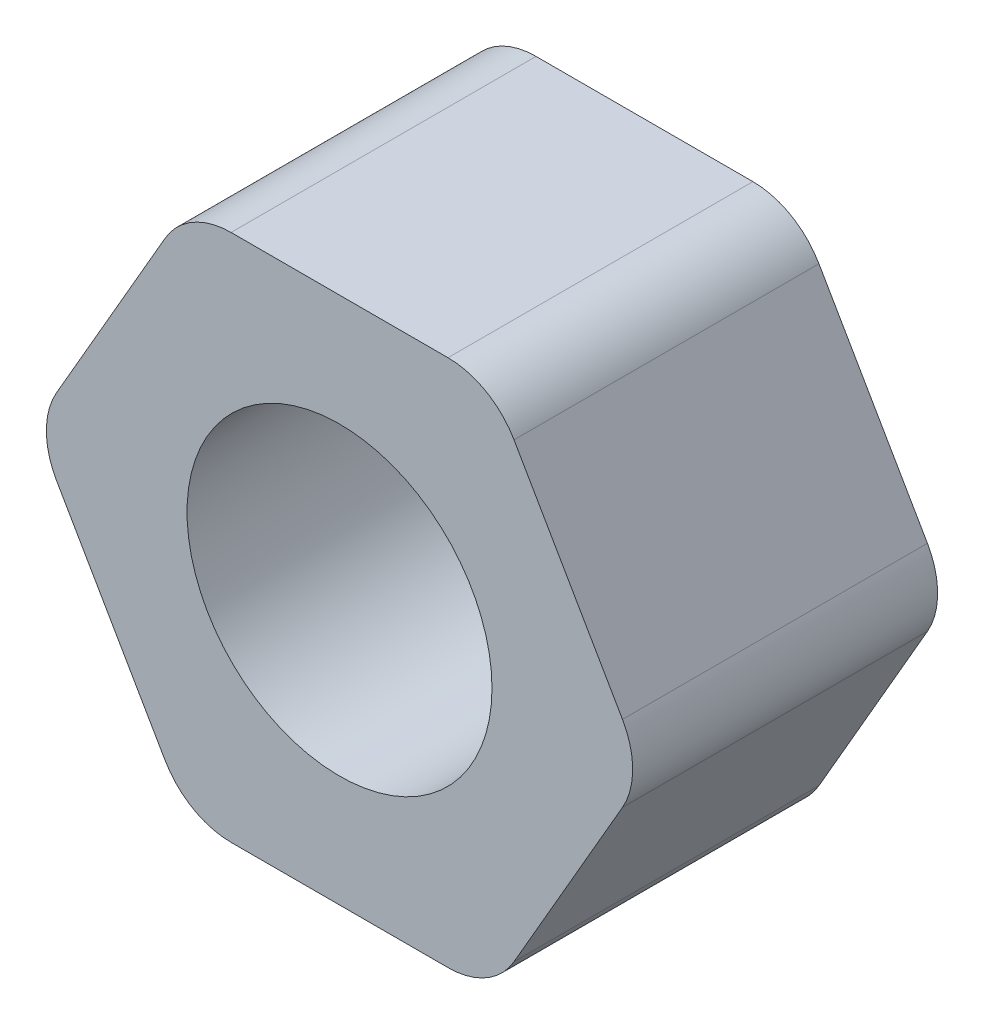
ISO-10303-21;
HEADER;
FILE_DESCRIPTION(('STEP AP214'),'2;1');
FILE_NAME('part.step','',(''),(''),'','','');
FILE_SCHEMA(('AUTOMOTIVE_DESIGN { 1 0 10303 214 1 1 1 1 }'));
ENDSEC;
DATA;
#1=APPLICATION_CONTEXT('core data for automotive mechanical design processes');
#2=APPLICATION_PROTOCOL_DEFINITION('international standard','automotive_design',2000,#1);
#3=PRODUCT_CONTEXT('',#1,'mechanical');
#4=PRODUCT('Part','Part','',(#3));
#5=PRODUCT_RELATED_PRODUCT_CATEGORY('part','',(#4));
#6=PRODUCT_DEFINITION_FORMATION('','',#4);
#7=PRODUCT_DEFINITION_CONTEXT('part definition',#1,'design');
#8=PRODUCT_DEFINITION('design','',#6,#7);
#9=PRODUCT_DEFINITION_SHAPE('','',#8);
#10=(LENGTH_UNIT() NAMED_UNIT(*) SI_UNIT(.MILLI.,.METRE.));
#11=(NAMED_UNIT(*) PLANE_ANGLE_UNIT() SI_UNIT($,.RADIAN.));
#12=(NAMED_UNIT(*) SI_UNIT($,.STERADIAN.) SOLID_ANGLE_UNIT());
#13=UNCERTAINTY_MEASURE_WITH_UNIT(LENGTH_MEASURE(1.E-05),#10,'distance_accuracy_value','');
#14=(GEOMETRIC_REPRESENTATION_CONTEXT(3) GLOBAL_UNCERTAINTY_ASSIGNED_CONTEXT((#13)) GLOBAL_UNIT_ASSIGNED_CONTEXT((#10,
#11,#12)) REPRESENTATION_CONTEXT('',''));
#15=CARTESIAN_POINT('',(0.,0.,0.));
#16=DIRECTION('',(0.,0.,1.));
#17=DIRECTION('',(1.,0.,0.));
#18=AXIS2_PLACEMENT_3D('',#15,#16,#17);
#19=CARTESIAN_POINT('',(-2.84529946162075,0.,4.));
#20=DIRECTION('',(0.,0.,1.));
#21=DIRECTION('',(1.,0.,0.));
#22=AXIS2_PLACEMENT_3D('',#19,#20,#21);
#23=PLANE('',#22);
#24=CARTESIAN_POINT('',(-2.84529946162075,0.,4.));
#25=DIRECTION('',(0.,0.,1.));
#26=DIRECTION('',(1.,0.,0.));
#27=AXIS2_PLACEMENT_3D('',#24,#25,#26);
#28=CIRCLE('',#27,0.999999999999999);
#29=CARTESIAN_POINT('',(-3.71132486540519,0.499999999999999,4.));
#30=VERTEX_POINT('',#29);
#31=CARTESIAN_POINT('',(-3.71132486540519,-0.5,4.));
#32=VERTEX_POINT('',#31);
#33=EDGE_CURVE('E177',#30,#32,#28,.T.);
#34=ORIENTED_EDGE('',*,*,#33,.T.);
#35=DIRECTION('',(0.5,-0.866025403784439,0.));
#36=VECTOR('',#35,1.);
#37=CARTESIAN_POINT('',(-3.71132486540519,-0.5,4.));
#38=LINE('',#37,#36);
#39=CARTESIAN_POINT('',(-2.28867513459481,-2.96410161513776,4.));
#40=VERTEX_POINT('',#39);
#41=EDGE_CURVE('E105',#32,#40,#38,.T.);
#42=ORIENTED_EDGE('',*,*,#41,.T.);
#43=CARTESIAN_POINT('',(-1.42264973081037,-2.46410161513776,4.));
#44=DIRECTION('',(0.,0.,1.));
#45=DIRECTION('',(1.,0.,0.));
#46=AXIS2_PLACEMENT_3D('',#43,#44,#45);
#47=CIRCLE('',#46,1.);
#48=CARTESIAN_POINT('',(-1.42264973081037,-3.46410161513776,4.));
#49=VERTEX_POINT('',#48);
#50=EDGE_CURVE('E204',#40,#49,#47,.T.);
#51=ORIENTED_EDGE('',*,*,#50,.T.);
#52=DIRECTION('',(1.,0.,0.));
#53=VECTOR('',#52,1.);
#54=CARTESIAN_POINT('',(-1.42264973081037,-3.46410161513776,4.));
#55=LINE('',#54,#53);
#56=CARTESIAN_POINT('',(1.42264973081038,-3.46410161513776,4.));
#57=VERTEX_POINT('',#56);
#58=EDGE_CURVE('E223',#49,#57,#55,.T.);
#59=ORIENTED_EDGE('',*,*,#58,.T.);
#60=CARTESIAN_POINT('',(1.42264973081038,-2.46410161513776,4.));
#61=DIRECTION('',(0.,0.,1.));
#62=DIRECTION('',(1.,0.,0.));
#63=AXIS2_PLACEMENT_3D('',#60,#61,#62);
#64=CIRCLE('',#63,1.);
#65=CARTESIAN_POINT('',(2.28867513459481,-2.96410161513776,4.));
#66=VERTEX_POINT('',#65);
#67=EDGE_CURVE('E220',#57,#66,#64,.T.);
#68=ORIENTED_EDGE('',*,*,#67,.T.);
#69=DIRECTION('',(0.5,0.866025403784439,0.));
#70=VECTOR('',#69,1.);
#71=CARTESIAN_POINT('',(2.28867513459481,-2.96410161513776,4.));
#72=LINE('',#71,#70);
#73=CARTESIAN_POINT('',(3.71132486540519,-0.5,4.));
#74=VERTEX_POINT('',#73);
#75=EDGE_CURVE('E222',#66,#74,#72,.T.);
#76=ORIENTED_EDGE('',*,*,#75,.T.);
#77=CARTESIAN_POINT('',(2.84529946162075,0.,4.));
#78=DIRECTION('',(0.,0.,1.));
#79=DIRECTION('',(-1.,0.,0.));
#80=AXIS2_PLACEMENT_3D('',#77,#78,#79);
#81=CIRCLE('',#80,1.);
#82=CARTESIAN_POINT('',(3.71132486540519,0.5,4.));
#83=VERTEX_POINT('',#82);
#84=EDGE_CURVE('E225',#74,#83,#81,.T.);
#85=ORIENTED_EDGE('',*,*,#84,.T.);
#86=DIRECTION('',(-0.5,0.866025403784439,0.));
#87=VECTOR('',#86,1.);
#88=CARTESIAN_POINT('',(3.71132486540519,0.5,4.));
#89=LINE('',#88,#87);
#90=CARTESIAN_POINT('',(2.28867513459481,2.96410161513776,4.));
#91=VERTEX_POINT('',#90);
#92=EDGE_CURVE('E231',#83,#91,#89,.T.);
#93=ORIENTED_EDGE('',*,*,#92,.T.);
#94=CARTESIAN_POINT('',(1.42264973081038,2.46410161513776,4.));
#95=DIRECTION('',(0.,0.,1.));
#96=DIRECTION('',(1.,0.,0.));
#97=AXIS2_PLACEMENT_3D('',#94,#95,#96);
#98=CIRCLE('',#97,1.);
#99=CARTESIAN_POINT('',(1.42264973081038,3.46410161513776,4.));
#100=VERTEX_POINT('',#99);
#101=EDGE_CURVE('E136',#91,#100,#98,.T.);
#102=ORIENTED_EDGE('',*,*,#101,.T.);
#103=DIRECTION('',(-1.,0.,0.));
#104=VECTOR('',#103,1.);
#105=CARTESIAN_POINT('',(1.42264973081038,3.46410161513776,4.));
#106=LINE('',#105,#104);
#107=CARTESIAN_POINT('',(-1.42264973081038,3.46410161513776,4.));
#108=VERTEX_POINT('',#107);
#109=EDGE_CURVE('E130',#100,#108,#106,.T.);
#110=ORIENTED_EDGE('',*,*,#109,.T.);
#111=CARTESIAN_POINT('',(-1.42264973081038,2.46410161513776,4.));
#112=DIRECTION('',(0.,0.,1.));
#113=DIRECTION('',(1.,0.,0.));
#114=AXIS2_PLACEMENT_3D('',#111,#112,#113);
#115=CIRCLE('',#114,1.);
#116=CARTESIAN_POINT('',(-2.28867513459481,2.96410161513776,4.));
#117=VERTEX_POINT('',#116);
#118=EDGE_CURVE('E134',#108,#117,#115,.T.);
#119=ORIENTED_EDGE('',*,*,#118,.T.);
#120=DIRECTION('',(-0.5,-0.866025403784439,0.));
#121=VECTOR('',#120,1.);
#122=CARTESIAN_POINT('',(-2.28867513459481,2.96410161513776,4.));
#123=LINE('',#122,#121);
#124=EDGE_CURVE('E50',#117,#30,#123,.T.);
#125=ORIENTED_EDGE('',*,*,#124,.T.);
#126=EDGE_LOOP('',(#34,#42,#51,#59,#68,#76,#85,#93,#102,#110,#119,#125));
#127=FACE_BOUND('',#126,.T.);
#128=CARTESIAN_POINT('',(0.,0.,4.));
#129=DIRECTION('',(0.,0.,1.));
#130=DIRECTION('',(1.,0.,0.));
#131=AXIS2_PLACEMENT_3D('',#128,#129,#130);
#132=CIRCLE('',#131,2.);
#133=CARTESIAN_POINT('',(2.,0.,4.));
#134=VERTEX_POINT('',#133);
#135=EDGE_CURVE('E158',#134,#134,#132,.T.);
#136=ORIENTED_EDGE('',*,*,#135,.F.);
#137=EDGE_LOOP('',(#136));
#138=FACE_BOUND('',#137,.T.);
#139=ADVANCED_FACE('F33',(#127,#138),#23,.T.);
#140=CARTESIAN_POINT('',(-2.84529946162075,0.,0.));
#141=DIRECTION('',(0.,0.,1.));
#142=DIRECTION('',(1.,0.,0.));
#143=AXIS2_PLACEMENT_3D('',#140,#141,#142);
#144=PLANE('',#143);
#145=CARTESIAN_POINT('',(-2.84529946162075,0.,0.));
#146=DIRECTION('',(0.,0.,1.));
#147=DIRECTION('',(1.,0.,0.));
#148=AXIS2_PLACEMENT_3D('',#145,#146,#147);
#149=CIRCLE('',#148,0.999999999999999);
#150=CARTESIAN_POINT('',(-3.71132486540519,0.499999999999999,0.));
#151=VERTEX_POINT('',#150);
#152=CARTESIAN_POINT('',(-3.71132486540519,-0.5,0.));
#153=VERTEX_POINT('',#152);
#154=EDGE_CURVE('E154',#151,#153,#149,.T.);
#155=ORIENTED_EDGE('',*,*,#154,.F.);
#156=DIRECTION('',(-0.5,-0.866025403784439,0.));
#157=VECTOR('',#156,1.);
#158=CARTESIAN_POINT('',(-2.28867513459481,2.96410161513776,0.));
#159=LINE('',#158,#157);
#160=CARTESIAN_POINT('',(-2.28867513459481,2.96410161513776,0.));
#161=VERTEX_POINT('',#160);
#162=EDGE_CURVE('E97',#161,#151,#159,.T.);
#163=ORIENTED_EDGE('',*,*,#162,.F.);
#164=CARTESIAN_POINT('',(-1.42264973081038,2.46410161513776,0.));
#165=DIRECTION('',(0.,0.,1.));
#166=DIRECTION('',(1.,0.,0.));
#167=AXIS2_PLACEMENT_3D('',#164,#165,#166);
#168=CIRCLE('',#167,1.);
#169=CARTESIAN_POINT('',(-1.42264973081038,3.46410161513776,0.));
#170=VERTEX_POINT('',#169);
#171=EDGE_CURVE('E91',#170,#161,#168,.T.);
#172=ORIENTED_EDGE('',*,*,#171,.F.);
#173=DIRECTION('',(-1.,0.,0.));
#174=VECTOR('',#173,1.);
#175=CARTESIAN_POINT('',(1.42264973081038,3.46410161513776,0.));
#176=LINE('',#175,#174);
#177=CARTESIAN_POINT('',(1.42264973081038,3.46410161513776,0.));
#178=VERTEX_POINT('',#177);
#179=EDGE_CURVE('E144',#178,#170,#176,.T.);
#180=ORIENTED_EDGE('',*,*,#179,.F.);
#181=CARTESIAN_POINT('',(1.42264973081038,2.46410161513776,0.));
#182=DIRECTION('',(0.,0.,1.));
#183=DIRECTION('',(1.,0.,0.));
#184=AXIS2_PLACEMENT_3D('',#181,#182,#183);
#185=CIRCLE('',#184,1.);
#186=CARTESIAN_POINT('',(2.28867513459481,2.96410161513776,0.));
#187=VERTEX_POINT('',#186);
#188=EDGE_CURVE('E172',#187,#178,#185,.T.);
#189=ORIENTED_EDGE('',*,*,#188,.F.);
#190=DIRECTION('',(-0.5,0.866025403784439,0.));
#191=VECTOR('',#190,1.);
#192=CARTESIAN_POINT('',(3.71132486540519,0.5,0.));
#193=LINE('',#192,#191);
#194=CARTESIAN_POINT('',(3.71132486540519,0.5,0.));
#195=VERTEX_POINT('',#194);
#196=EDGE_CURVE('E170',#195,#187,#193,.T.);
#197=ORIENTED_EDGE('',*,*,#196,.F.);
#198=CARTESIAN_POINT('',(2.84529946162075,0.,0.));
#199=DIRECTION('',(0.,0.,1.));
#200=DIRECTION('',(-1.,0.,0.));
#201=AXIS2_PLACEMENT_3D('',#198,#199,#200);
#202=CIRCLE('',#201,1.);
#203=CARTESIAN_POINT('',(3.71132486540519,-0.5,0.));
#204=VERTEX_POINT('',#203);
#205=EDGE_CURVE('E168',#204,#195,#202,.T.);
#206=ORIENTED_EDGE('',*,*,#205,.F.);
#207=DIRECTION('',(0.5,0.866025403784439,0.));
#208=VECTOR('',#207,1.);
#209=CARTESIAN_POINT('',(2.28867513459481,-2.96410161513776,0.));
#210=LINE('',#209,#208);
#211=CARTESIAN_POINT('',(2.28867513459481,-2.96410161513776,0.));
#212=VERTEX_POINT('',#211);
#213=EDGE_CURVE('E166',#212,#204,#210,.T.);
#214=ORIENTED_EDGE('',*,*,#213,.F.);
#215=CARTESIAN_POINT('',(1.42264973081038,-2.46410161513776,0.));
#216=DIRECTION('',(0.,0.,1.));
#217=DIRECTION('',(1.,0.,0.));
#218=AXIS2_PLACEMENT_3D('',#215,#216,#217);
#219=CIRCLE('',#218,1.);
#220=CARTESIAN_POINT('',(1.42264973081038,-3.46410161513776,0.));
#221=VERTEX_POINT('',#220);
#222=EDGE_CURVE('E164',#221,#212,#219,.T.);
#223=ORIENTED_EDGE('',*,*,#222,.F.);
#224=DIRECTION('',(1.,0.,0.));
#225=VECTOR('',#224,1.);
#226=CARTESIAN_POINT('',(-1.42264973081037,-3.46410161513776,0.));
#227=LINE('',#226,#225);
#228=CARTESIAN_POINT('',(-1.42264973081037,-3.46410161513776,0.));
#229=VERTEX_POINT('',#228);
#230=EDGE_CURVE('E162',#229,#221,#227,.T.);
#231=ORIENTED_EDGE('',*,*,#230,.F.);
#232=CARTESIAN_POINT('',(-1.42264973081037,-2.46410161513776,0.));
#233=DIRECTION('',(0.,0.,1.));
#234=DIRECTION('',(1.,0.,0.));
#235=AXIS2_PLACEMENT_3D('',#232,#233,#234);
#236=CIRCLE('',#235,1.);
#237=CARTESIAN_POINT('',(-2.28867513459481,-2.96410161513776,0.));
#238=VERTEX_POINT('',#237);
#239=EDGE_CURVE('E160',#238,#229,#236,.T.);
#240=ORIENTED_EDGE('',*,*,#239,.F.);
#241=DIRECTION('',(0.5,-0.866025403784439,0.));
#242=VECTOR('',#241,1.);
#243=CARTESIAN_POINT('',(-3.71132486540519,-0.5,0.));
#244=LINE('',#243,#242);
#245=EDGE_CURVE('E157',#153,#238,#244,.T.);
#246=ORIENTED_EDGE('',*,*,#245,.F.);
#247=EDGE_LOOP('',(#155,#163,#172,#180,#189,#197,#206,#214,#223,#231,#240,#246));
#248=FACE_BOUND('',#247,.T.);
#249=CARTESIAN_POINT('',(0.,0.,0.));
#250=DIRECTION('',(0.,0.,1.));
#251=DIRECTION('',(1.,0.,0.));
#252=AXIS2_PLACEMENT_3D('',#249,#250,#251);
#253=CIRCLE('',#252,2.);
#254=CARTESIAN_POINT('',(2.,0.,0.));
#255=VERTEX_POINT('',#254);
#256=EDGE_CURVE('E378',#255,#255,#253,.T.);
#257=ORIENTED_EDGE('',*,*,#256,.T.);
#258=EDGE_LOOP('',(#257));
#259=FACE_BOUND('',#258,.T.);
#260=ADVANCED_FACE('F208',(#248,#259),#144,.F.);
#261=CARTESIAN_POINT('',(-2.84529946162075,0.,4.));
#262=DIRECTION('',(0.,0.,-1.));
#263=DIRECTION('',(-1.,0.,0.));
#264=AXIS2_PLACEMENT_3D('',#261,#262,#263);
#265=CYLINDRICAL_SURFACE('',#264,0.999999999999999);
#266=ORIENTED_EDGE('',*,*,#154,.T.);
#267=DIRECTION('',(0.,0.,-1.));
#268=VECTOR('',#267,1.);
#269=CARTESIAN_POINT('',(-3.71132486540519,-0.5,4.));
#270=LINE('',#269,#268);
#271=EDGE_CURVE('E11',#32,#153,#270,.T.);
#272=ORIENTED_EDGE('',*,*,#271,.F.);
#273=ORIENTED_EDGE('',*,*,#33,.F.);
#274=DIRECTION('',(0.,0.,-1.));
#275=VECTOR('',#274,1.);
#276=CARTESIAN_POINT('',(-3.71132486540519,0.499999999999999,4.));
#277=LINE('',#276,#275);
#278=EDGE_CURVE('E150',#30,#151,#277,.T.);
#279=ORIENTED_EDGE('',*,*,#278,.T.);
#280=EDGE_LOOP('',(#266,#272,#273,#279));
#281=FACE_BOUND('',#280,.T.);
#282=ADVANCED_FACE('F35',(#281),#265,.T.);
#283=CARTESIAN_POINT('',(-3.71132486540519,-0.5,4.));
#284=DIRECTION('',(0.866025403784439,0.5,0.));
#285=DIRECTION('',(-0.5,0.866025403784439,0.));
#286=AXIS2_PLACEMENT_3D('',#283,#284,#285);
#287=PLANE('',#286);
#288=ORIENTED_EDGE('',*,*,#245,.T.);
#289=DIRECTION('',(0.,0.,-1.));
#290=VECTOR('',#289,1.);
#291=CARTESIAN_POINT('',(-2.28867513459481,-2.96410161513776,4.));
#292=LINE('',#291,#290);
#293=EDGE_CURVE('E42',#40,#238,#292,.T.);
#294=ORIENTED_EDGE('',*,*,#293,.F.);
#295=ORIENTED_EDGE('',*,*,#41,.F.);
#296=ORIENTED_EDGE('',*,*,#271,.T.);
#297=EDGE_LOOP('',(#288,#294,#295,#296));
#298=FACE_BOUND('',#297,.T.);
#299=ADVANCED_FACE('F265',(#298),#287,.F.);
#300=CARTESIAN_POINT('',(-1.42264973081037,-2.46410161513776,4.));
#301=DIRECTION('',(0.,0.,-1.));
#302=DIRECTION('',(-1.,0.,0.));
#303=AXIS2_PLACEMENT_3D('',#300,#301,#302);
#304=CYLINDRICAL_SURFACE('',#303,1.);
#305=ORIENTED_EDGE('',*,*,#239,.T.);
#306=DIRECTION('',(0.,0.,-1.));
#307=VECTOR('',#306,1.);
#308=CARTESIAN_POINT('',(-1.42264973081037,-3.46410161513776,4.));
#309=LINE('',#308,#307);
#310=EDGE_CURVE('E196',#49,#229,#309,.T.);
#311=ORIENTED_EDGE('',*,*,#310,.F.);
#312=ORIENTED_EDGE('',*,*,#50,.F.);
#313=ORIENTED_EDGE('',*,*,#293,.T.);
#314=EDGE_LOOP('',(#305,#311,#312,#313));
#315=FACE_BOUND('',#314,.T.);
#316=ADVANCED_FACE('F202',(#315),#304,.T.);
#317=CARTESIAN_POINT('',(-1.42264973081037,-3.46410161513776,4.));
#318=DIRECTION('',(0.,1.,0.));
#319=DIRECTION('',(0.,0.,1.));
#320=AXIS2_PLACEMENT_3D('',#317,#318,#319);
#321=PLANE('',#320);
#322=ORIENTED_EDGE('',*,*,#230,.T.);
#323=DIRECTION('',(0.,0.,-1.));
#324=VECTOR('',#323,1.);
#325=CARTESIAN_POINT('',(1.42264973081038,-3.46410161513776,4.));
#326=LINE('',#325,#324);
#327=EDGE_CURVE('E193',#57,#221,#326,.T.);
#328=ORIENTED_EDGE('',*,*,#327,.F.);
#329=ORIENTED_EDGE('',*,*,#58,.F.);
#330=ORIENTED_EDGE('',*,*,#310,.T.);
#331=EDGE_LOOP('',(#322,#328,#329,#330));
#332=FACE_BOUND('',#331,.T.);
#333=ADVANCED_FACE('F214',(#332),#321,.F.);
#334=CARTESIAN_POINT('',(1.42264973081038,-2.46410161513776,4.));
#335=DIRECTION('',(0.,0.,-1.));
#336=DIRECTION('',(-1.,0.,0.));
#337=AXIS2_PLACEMENT_3D('',#334,#335,#336);
#338=CYLINDRICAL_SURFACE('',#337,1.);
#339=ORIENTED_EDGE('',*,*,#222,.T.);
#340=DIRECTION('',(0.,0.,-1.));
#341=VECTOR('',#340,1.);
#342=CARTESIAN_POINT('',(2.28867513459481,-2.96410161513776,4.));
#343=LINE('',#342,#341);
#344=EDGE_CURVE('E190',#66,#212,#343,.T.);
#345=ORIENTED_EDGE('',*,*,#344,.F.);
#346=ORIENTED_EDGE('',*,*,#67,.F.);
#347=ORIENTED_EDGE('',*,*,#327,.T.);
#348=EDGE_LOOP('',(#339,#345,#346,#347));
#349=FACE_BOUND('',#348,.T.);
#350=ADVANCED_FACE('F218',(#349),#338,.T.);
#351=CARTESIAN_POINT('',(2.28867513459481,-2.96410161513776,4.));
#352=DIRECTION('',(-0.866025403784439,0.5,0.));
#353=DIRECTION('',(-0.5,-0.866025403784439,0.));
#354=AXIS2_PLACEMENT_3D('',#351,#352,#353);
#355=PLANE('',#354);
#356=ORIENTED_EDGE('',*,*,#213,.T.);
#357=DIRECTION('',(0.,0.,-1.));
#358=VECTOR('',#357,1.);
#359=CARTESIAN_POINT('',(3.71132486540519,-0.5,4.));
#360=LINE('',#359,#358);
#361=EDGE_CURVE('E187',#74,#204,#360,.T.);
#362=ORIENTED_EDGE('',*,*,#361,.F.);
#363=ORIENTED_EDGE('',*,*,#75,.F.);
#364=ORIENTED_EDGE('',*,*,#344,.T.);
#365=EDGE_LOOP('',(#356,#362,#363,#364));
#366=FACE_BOUND('',#365,.T.);
#367=ADVANCED_FACE('F278',(#366),#355,.F.);
#368=CARTESIAN_POINT('',(2.84529946162075,0.,4.));
#369=DIRECTION('',(0.,0.,-1.));
#370=DIRECTION('',(-1.,0.,0.));
#371=AXIS2_PLACEMENT_3D('',#368,#369,#370);
#372=CYLINDRICAL_SURFACE('',#371,1.);
#373=ORIENTED_EDGE('',*,*,#205,.T.);
#374=DIRECTION('',(0.,0.,-1.));
#375=VECTOR('',#374,1.);
#376=CARTESIAN_POINT('',(3.71132486540519,0.5,4.));
#377=LINE('',#376,#375);
#378=EDGE_CURVE('E184',#83,#195,#377,.T.);
#379=ORIENTED_EDGE('',*,*,#378,.F.);
#380=ORIENTED_EDGE('',*,*,#84,.F.);
#381=ORIENTED_EDGE('',*,*,#361,.T.);
#382=EDGE_LOOP('',(#373,#379,#380,#381));
#383=FACE_BOUND('',#382,.T.);
#384=ADVANCED_FACE('F281',(#383),#372,.T.);
#385=CARTESIAN_POINT('',(3.71132486540519,0.5,4.));
#386=DIRECTION('',(-0.866025403784439,-0.5,0.));
#387=DIRECTION('',(0.5,-0.866025403784439,0.));
#388=AXIS2_PLACEMENT_3D('',#385,#386,#387);
#389=PLANE('',#388);
#390=ORIENTED_EDGE('',*,*,#196,.T.);
#391=DIRECTION('',(0.,0.,-1.));
#392=VECTOR('',#391,1.);
#393=CARTESIAN_POINT('',(2.28867513459481,2.96410161513776,4.));
#394=LINE('',#393,#392);
#395=EDGE_CURVE('E181',#91,#187,#394,.T.);
#396=ORIENTED_EDGE('',*,*,#395,.F.);
#397=ORIENTED_EDGE('',*,*,#92,.F.);
#398=ORIENTED_EDGE('',*,*,#378,.T.);
#399=EDGE_LOOP('',(#390,#396,#397,#398));
#400=FACE_BOUND('',#399,.T.);
#401=ADVANCED_FACE('F237',(#400),#389,.F.);
#402=CARTESIAN_POINT('',(1.42264973081038,2.46410161513776,4.));
#403=DIRECTION('',(0.,0.,-1.));
#404=DIRECTION('',(-1.,0.,0.));
#405=AXIS2_PLACEMENT_3D('',#402,#403,#404);
#406=CYLINDRICAL_SURFACE('',#405,1.);
#407=ORIENTED_EDGE('',*,*,#188,.T.);
#408=DIRECTION('',(0.,0.,-1.));
#409=VECTOR('',#408,1.);
#410=CARTESIAN_POINT('',(1.42264973081038,3.46410161513776,4.));
#411=LINE('',#410,#409);
#412=EDGE_CURVE('E145',#100,#178,#411,.T.);
#413=ORIENTED_EDGE('',*,*,#412,.F.);
#414=ORIENTED_EDGE('',*,*,#101,.F.);
#415=ORIENTED_EDGE('',*,*,#395,.T.);
#416=EDGE_LOOP('',(#407,#413,#414,#415));
#417=FACE_BOUND('',#416,.T.);
#418=ADVANCED_FACE('F241',(#417),#406,.T.);
#419=CARTESIAN_POINT('',(1.42264973081038,3.46410161513776,4.));
#420=DIRECTION('',(0.,-1.,0.));
#421=DIRECTION('',(1.,0.,0.));
#422=AXIS2_PLACEMENT_3D('',#419,#420,#421);
#423=PLANE('',#422);
#424=ORIENTED_EDGE('',*,*,#179,.T.);
#425=DIRECTION('',(0.,0.,-1.));
#426=VECTOR('',#425,1.);
#427=CARTESIAN_POINT('',(-1.42264973081038,3.46410161513776,4.));
#428=LINE('',#427,#426);
#429=EDGE_CURVE('E141',#108,#170,#428,.T.);
#430=ORIENTED_EDGE('',*,*,#429,.F.);
#431=ORIENTED_EDGE('',*,*,#109,.F.);
#432=ORIENTED_EDGE('',*,*,#412,.T.);
#433=EDGE_LOOP('',(#424,#430,#431,#432));
#434=FACE_BOUND('',#433,.T.);
#435=ADVANCED_FACE('F142',(#434),#423,.F.);
#436=CARTESIAN_POINT('',(-1.42264973081038,2.46410161513776,4.));
#437=DIRECTION('',(0.,0.,-1.));
#438=DIRECTION('',(-1.,0.,0.));
#439=AXIS2_PLACEMENT_3D('',#436,#437,#438);
#440=CYLINDRICAL_SURFACE('',#439,1.);
#441=ORIENTED_EDGE('',*,*,#171,.T.);
#442=DIRECTION('',(0.,0.,-1.));
#443=VECTOR('',#442,1.);
#444=CARTESIAN_POINT('',(-2.28867513459481,2.96410161513776,4.));
#445=LINE('',#444,#443);
#446=EDGE_CURVE('E146',#117,#161,#445,.T.);
#447=ORIENTED_EDGE('',*,*,#446,.F.);
#448=ORIENTED_EDGE('',*,*,#118,.F.);
#449=ORIENTED_EDGE('',*,*,#429,.T.);
#450=EDGE_LOOP('',(#441,#447,#448,#449));
#451=FACE_BOUND('',#450,.T.);
#452=ADVANCED_FACE('F148',(#451),#440,.T.);
#453=CARTESIAN_POINT('',(-2.28867513459481,2.96410161513776,4.));
#454=DIRECTION('',(0.866025403784439,-0.5,0.));
#455=DIRECTION('',(0.5,0.866025403784439,0.));
#456=AXIS2_PLACEMENT_3D('',#453,#454,#455);
#457=PLANE('',#456);
#458=ORIENTED_EDGE('',*,*,#162,.T.);
#459=ORIENTED_EDGE('',*,*,#278,.F.);
#460=ORIENTED_EDGE('',*,*,#124,.F.);
#461=ORIENTED_EDGE('',*,*,#446,.T.);
#462=EDGE_LOOP('',(#458,#459,#460,#461));
#463=FACE_BOUND('',#462,.T.);
#464=ADVANCED_FACE('F245',(#463),#457,.F.);
#465=CARTESIAN_POINT('',(0.,0.,4.));
#466=DIRECTION('',(0.,0.,-1.));
#467=DIRECTION('',(-1.,0.,0.));
#468=AXIS2_PLACEMENT_3D('',#465,#466,#467);
#469=CYLINDRICAL_SURFACE('',#468,2.);
#470=ORIENTED_EDGE('',*,*,#135,.T.);
#471=EDGE_LOOP('',(#470));
#472=FACE_BOUND('',#471,.T.);
#473=ORIENTED_EDGE('',*,*,#256,.F.);
#474=EDGE_LOOP('',(#473));
#475=FACE_BOUND('',#474,.T.);
#476=ADVANCED_FACE('F247',(#472,#475),#469,.F.);
#477=CLOSED_SHELL('',(#139,#260,#282,#299,#316,#333,#350,#367,#384,#401,#418,#435,#452,#464,#476));
#478=MANIFOLD_SOLID_BREP('B2',#477);
#479=ADVANCED_BREP_SHAPE_REPRESENTATION('',(#18,#478),#14);
#480=SHAPE_DEFINITION_REPRESENTATION(#9,#479);
ENDSEC;
END-ISO-10303-21;
